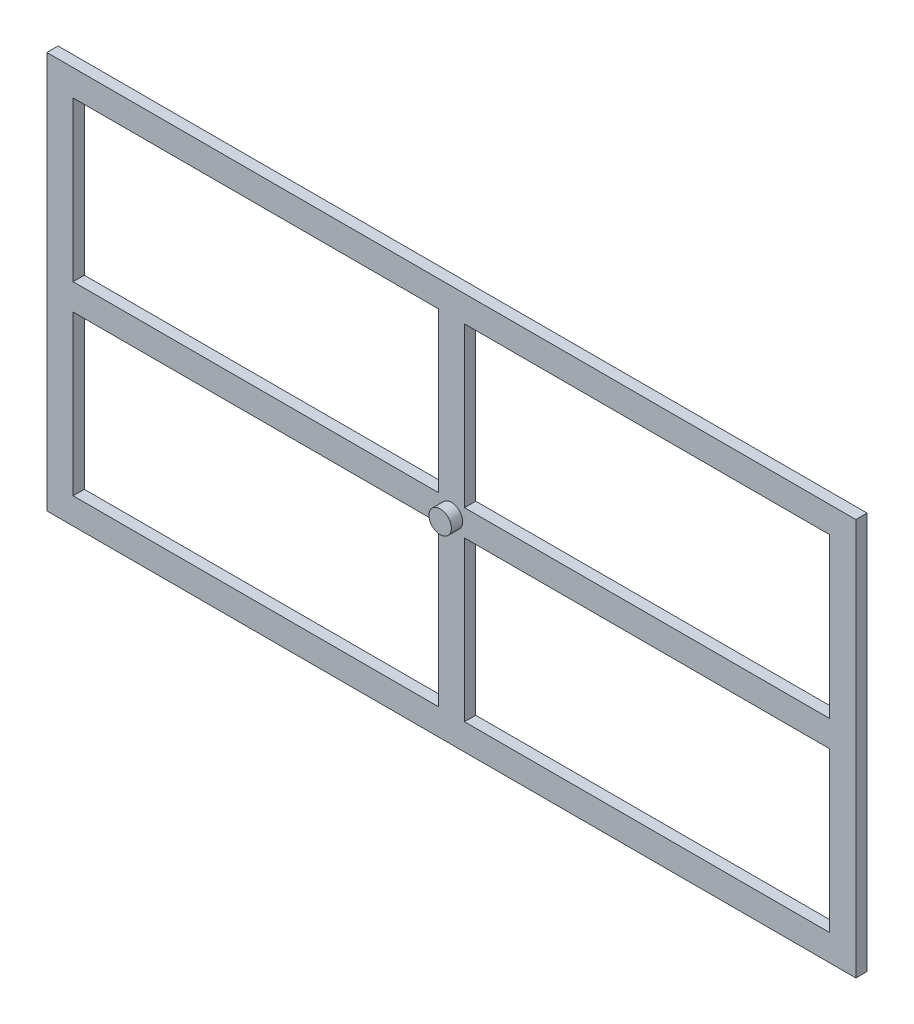
ISO-10303-21;
HEADER;
FILE_DESCRIPTION(('STEP AP214'),'2;1');
FILE_NAME('part.step','',(''),(''),'','','');
FILE_SCHEMA(('AUTOMOTIVE_DESIGN { 1 0 10303 214 1 1 1 1 }'));
ENDSEC;
DATA;
#1=APPLICATION_CONTEXT('core data for automotive mechanical design processes');
#2=APPLICATION_PROTOCOL_DEFINITION('international standard','automotive_design',2000,#1);
#3=PRODUCT_CONTEXT('',#1,'mechanical');
#4=PRODUCT('Part','Part','',(#3));
#5=PRODUCT_RELATED_PRODUCT_CATEGORY('part','',(#4));
#6=PRODUCT_DEFINITION_FORMATION('','',#4);
#7=PRODUCT_DEFINITION_CONTEXT('part definition',#1,'design');
#8=PRODUCT_DEFINITION('design','',#6,#7);
#9=PRODUCT_DEFINITION_SHAPE('','',#8);
#10=(LENGTH_UNIT() NAMED_UNIT(*) SI_UNIT(.MILLI.,.METRE.));
#11=(NAMED_UNIT(*) PLANE_ANGLE_UNIT() SI_UNIT($,.RADIAN.));
#12=(NAMED_UNIT(*) SI_UNIT($,.STERADIAN.) SOLID_ANGLE_UNIT());
#13=UNCERTAINTY_MEASURE_WITH_UNIT(LENGTH_MEASURE(1.E-05),#10,'distance_accuracy_value','');
#14=(GEOMETRIC_REPRESENTATION_CONTEXT(3) GLOBAL_UNCERTAINTY_ASSIGNED_CONTEXT((#13)) GLOBAL_UNIT_ASSIGNED_CONTEXT((#10,
#11,#12)) REPRESENTATION_CONTEXT('',''));
#15=CARTESIAN_POINT('',(0.,0.,0.));
#16=DIRECTION('',(0.,0.,1.));
#17=DIRECTION('',(1.,0.,0.));
#18=AXIS2_PLACEMENT_3D('',#15,#16,#17);
#19=CARTESIAN_POINT('',(0.,0.,3.));
#20=DIRECTION('',(0.,0.,1.));
#21=DIRECTION('',(1.,0.,0.));
#22=AXIS2_PLACEMENT_3D('',#19,#20,#21);
#23=PLANE('',#22);
#24=CARTESIAN_POINT('',(-24.3546378349002,-10.2943666012766,3.));
#25=DIRECTION('',(0.,0.,1.));
#26=DIRECTION('',(1.,0.,0.));
#27=AXIS2_PLACEMENT_3D('',#24,#25,#26);
#28=CIRCLE('',#27,3.);
#29=CARTESIAN_POINT('',(-21.3546378349002,-10.2943666012766,3.));
#30=VERTEX_POINT('',#29);
#31=EDGE_CURVE('E725',#30,#30,#28,.T.);
#32=ORIENTED_EDGE('',*,*,#31,.F.);
#33=EDGE_LOOP('',(#32));
#34=FACE_BOUND('',#33,.T.);
#35=DIRECTION('',(0.,-1.,0.));
#36=VECTOR('',#35,1.);
#37=CARTESIAN_POINT('',(-132.3546378349,42.7056333987234,3.));
#38=LINE('',#37,#36);
#39=CARTESIAN_POINT('',(-132.3546378349,42.7056333987234,3.));
#40=VERTEX_POINT('',#39);
#41=CARTESIAN_POINT('',(-132.3546378349,-63.2943666012766,3.));
#42=VERTEX_POINT('',#41);
#43=EDGE_CURVE('E361',#40,#42,#38,.T.);
#44=ORIENTED_EDGE('',*,*,#43,.T.);
#45=DIRECTION('',(1.,0.,0.));
#46=VECTOR('',#45,1.);
#47=CARTESIAN_POINT('',(-132.3546378349,-63.2943666012766,3.));
#48=LINE('',#47,#46);
#49=CARTESIAN_POINT('',(83.6453621650998,-63.2943666012766,3.));
#50=VERTEX_POINT('',#49);
#51=EDGE_CURVE('E365',#42,#50,#48,.T.);
#52=ORIENTED_EDGE('',*,*,#51,.T.);
#53=DIRECTION('',(0.,1.,0.));
#54=VECTOR('',#53,1.);
#55=CARTESIAN_POINT('',(83.6453621650998,42.7056333987234,3.));
#56=LINE('',#55,#54);
#57=CARTESIAN_POINT('',(83.6453621650998,42.7056333987234,3.));
#58=VERTEX_POINT('',#57);
#59=EDGE_CURVE('E369',#50,#58,#56,.T.);
#60=ORIENTED_EDGE('',*,*,#59,.T.);
#61=DIRECTION('',(-1.,0.,0.));
#62=VECTOR('',#61,1.);
#63=CARTESIAN_POINT('',(-132.3546378349,42.7056333987234,3.));
#64=LINE('',#63,#62);
#65=EDGE_CURVE('E372',#58,#40,#64,.T.);
#66=ORIENTED_EDGE('',*,*,#65,.T.);
#67=EDGE_LOOP('',(#44,#52,#60,#66));
#68=FACE_BOUND('',#67,.T.);
#69=DIRECTION('',(1.,0.,0.));
#70=VECTOR('',#69,1.);
#71=CARTESIAN_POINT('',(-125.3546378349,-6.7943666012766,3.));
#72=LINE('',#71,#70);
#73=CARTESIAN_POINT('',(-125.3546378349,-6.7943666012766,3.));
#74=VERTEX_POINT('',#73);
#75=CARTESIAN_POINT('',(-27.8546378349002,-6.7943666012766,3.));
#76=VERTEX_POINT('',#75);
#77=EDGE_CURVE('E321',#74,#76,#72,.T.);
#78=ORIENTED_EDGE('',*,*,#77,.F.);
#79=DIRECTION('',(0.,-1.,0.));
#80=VECTOR('',#79,1.);
#81=CARTESIAN_POINT('',(-125.3546378349,35.7056333987234,3.));
#82=LINE('',#81,#80);
#83=CARTESIAN_POINT('',(-125.3546378349,35.7056333987234,3.));
#84=VERTEX_POINT('',#83);
#85=EDGE_CURVE('E318',#84,#74,#82,.T.);
#86=ORIENTED_EDGE('',*,*,#85,.F.);
#87=DIRECTION('',(-1.,0.,0.));
#88=VECTOR('',#87,1.);
#89=CARTESIAN_POINT('',(-125.3546378349,35.7056333987234,3.));
#90=LINE('',#89,#88);
#91=CARTESIAN_POINT('',(-27.8546378349002,35.7056333987234,3.));
#92=VERTEX_POINT('',#91);
#93=EDGE_CURVE('E329',#92,#84,#90,.T.);
#94=ORIENTED_EDGE('',*,*,#93,.F.);
#95=DIRECTION('',(0.,1.,0.));
#96=VECTOR('',#95,1.);
#97=CARTESIAN_POINT('',(-27.8546378349002,35.7056333987234,3.));
#98=LINE('',#97,#96);
#99=EDGE_CURVE('E325',#76,#92,#98,.T.);
#100=ORIENTED_EDGE('',*,*,#99,.F.);
#101=EDGE_LOOP('',(#78,#86,#94,#100));
#102=FACE_BOUND('',#101,.T.);
#103=DIRECTION('',(1.,0.,0.));
#104=VECTOR('',#103,1.);
#105=CARTESIAN_POINT('',(-20.8546378349002,-6.7943666012766,3.));
#106=LINE('',#105,#104);
#107=CARTESIAN_POINT('',(-20.8546378349002,-6.7943666012766,3.));
#108=VERTEX_POINT('',#107);
#109=CARTESIAN_POINT('',(76.6453621650998,-6.7943666012766,3.));
#110=VERTEX_POINT('',#109);
#111=EDGE_CURVE('E278',#108,#110,#106,.T.);
#112=ORIENTED_EDGE('',*,*,#111,.F.);
#113=DIRECTION('',(0.,-1.,0.));
#114=VECTOR('',#113,1.);
#115=CARTESIAN_POINT('',(-20.8546378349002,35.7056333987234,3.));
#116=LINE('',#115,#114);
#117=CARTESIAN_POINT('',(-20.8546378349002,35.7056333987234,3.));
#118=VERTEX_POINT('',#117);
#119=EDGE_CURVE('E275',#118,#108,#116,.T.);
#120=ORIENTED_EDGE('',*,*,#119,.F.);
#121=DIRECTION('',(-1.,0.,0.));
#122=VECTOR('',#121,1.);
#123=CARTESIAN_POINT('',(-20.8546378349002,35.7056333987234,3.));
#124=LINE('',#123,#122);
#125=CARTESIAN_POINT('',(76.6453621650998,35.7056333987234,3.));
#126=VERTEX_POINT('',#125);
#127=EDGE_CURVE('E286',#126,#118,#124,.T.);
#128=ORIENTED_EDGE('',*,*,#127,.F.);
#129=DIRECTION('',(0.,1.,0.));
#130=VECTOR('',#129,1.);
#131=CARTESIAN_POINT('',(76.6453621650998,35.7056333987234,3.));
#132=LINE('',#131,#130);
#133=EDGE_CURVE('E282',#110,#126,#132,.T.);
#134=ORIENTED_EDGE('',*,*,#133,.F.);
#135=EDGE_LOOP('',(#112,#120,#128,#134));
#136=FACE_BOUND('',#135,.T.);
#137=DIRECTION('',(1.,0.,0.));
#138=VECTOR('',#137,1.);
#139=CARTESIAN_POINT('',(-20.8546378349002,-56.2943666012766,3.));
#140=LINE('',#139,#138);
#141=CARTESIAN_POINT('',(-20.8546378349002,-56.2943666012766,3.));
#142=VERTEX_POINT('',#141);
#143=CARTESIAN_POINT('',(76.6453621650998,-56.2943666012766,3.));
#144=VERTEX_POINT('',#143);
#145=EDGE_CURVE('E235',#142,#144,#140,.T.);
#146=ORIENTED_EDGE('',*,*,#145,.F.);
#147=DIRECTION('',(0.,-1.,0.));
#148=VECTOR('',#147,1.);
#149=CARTESIAN_POINT('',(-20.8546378349002,-13.7943666012766,3.));
#150=LINE('',#149,#148);
#151=CARTESIAN_POINT('',(-20.8546378349002,-13.7943666012766,3.));
#152=VERTEX_POINT('',#151);
#153=EDGE_CURVE('E232',#152,#142,#150,.T.);
#154=ORIENTED_EDGE('',*,*,#153,.F.);
#155=DIRECTION('',(-1.,0.,0.));
#156=VECTOR('',#155,1.);
#157=CARTESIAN_POINT('',(-20.8546378349002,-13.7943666012766,3.));
#158=LINE('',#157,#156);
#159=CARTESIAN_POINT('',(76.6453621650998,-13.7943666012766,3.));
#160=VERTEX_POINT('',#159);
#161=EDGE_CURVE('E243',#160,#152,#158,.T.);
#162=ORIENTED_EDGE('',*,*,#161,.F.);
#163=DIRECTION('',(0.,1.,0.));
#164=VECTOR('',#163,1.);
#165=CARTESIAN_POINT('',(76.6453621650998,-13.7943666012766,3.));
#166=LINE('',#165,#164);
#167=EDGE_CURVE('E239',#144,#160,#166,.T.);
#168=ORIENTED_EDGE('',*,*,#167,.F.);
#169=EDGE_LOOP('',(#146,#154,#162,#168));
#170=FACE_BOUND('',#169,.T.);
#171=DIRECTION('',(-1.,0.,0.));
#172=VECTOR('',#171,1.);
#173=CARTESIAN_POINT('',(-27.8546378349002,-13.7943666012766,3.));
#174=LINE('',#173,#172);
#175=CARTESIAN_POINT('',(-27.8546378349002,-13.7943666012766,3.));
#176=VERTEX_POINT('',#175);
#177=CARTESIAN_POINT('',(-125.3546378349,-13.7943666012766,3.));
#178=VERTEX_POINT('',#177);
#179=EDGE_CURVE('E191',#176,#178,#174,.T.);
#180=ORIENTED_EDGE('',*,*,#179,.F.);
#181=DIRECTION('',(0.,1.,0.));
#182=VECTOR('',#181,1.);
#183=CARTESIAN_POINT('',(-27.8546378349002,-56.2943666012766,3.));
#184=LINE('',#183,#182);
#185=CARTESIAN_POINT('',(-27.8546378349002,-56.2943666012766,3.));
#186=VERTEX_POINT('',#185);
#187=EDGE_CURVE('E182',#186,#176,#184,.T.);
#188=ORIENTED_EDGE('',*,*,#187,.F.);
#189=DIRECTION('',(1.,0.,0.));
#190=VECTOR('',#189,1.);
#191=CARTESIAN_POINT('',(-27.8546378349002,-56.2943666012766,3.));
#192=LINE('',#191,#190);
#193=CARTESIAN_POINT('',(-125.3546378349,-56.2943666012766,3.));
#194=VERTEX_POINT('',#193);
#195=EDGE_CURVE('E208',#194,#186,#192,.T.);
#196=ORIENTED_EDGE('',*,*,#195,.F.);
#197=DIRECTION('',(0.,-1.,0.));
#198=VECTOR('',#197,1.);
#199=CARTESIAN_POINT('',(-125.3546378349,-56.2943666012766,3.));
#200=LINE('',#199,#198);
#201=EDGE_CURVE('E204',#178,#194,#200,.T.);
#202=ORIENTED_EDGE('',*,*,#201,.F.);
#203=EDGE_LOOP('',(#180,#188,#196,#202));
#204=FACE_BOUND('',#203,.T.);
#205=ADVANCED_FACE('F44',(#34,#68,#102,#136,#170,#204),#23,.T.);
#206=CARTESIAN_POINT('',(0.,0.,0.));
#207=DIRECTION('',(0.,0.,1.));
#208=DIRECTION('',(1.,0.,0.));
#209=AXIS2_PLACEMENT_3D('',#206,#207,#208);
#210=PLANE('',#209);
#211=CARTESIAN_POINT('',(-128.3546378349,38.7056333987234,0.));
#212=DIRECTION('',(0.,0.,-1.));
#213=DIRECTION('',(-1.,0.,0.));
#214=AXIS2_PLACEMENT_3D('',#211,#212,#213);
#215=CIRCLE('',#214,2.);
#216=CARTESIAN_POINT('',(-130.3546378349,38.7056333987234,0.));
#217=VERTEX_POINT('',#216);
#218=EDGE_CURVE('E704',#217,#217,#215,.T.);
#219=ORIENTED_EDGE('',*,*,#218,.F.);
#220=EDGE_LOOP('',(#219));
#221=FACE_BOUND('',#220,.T.);
#222=CARTESIAN_POINT('',(79.6453621650998,-59.2943666012766,0.));
#223=DIRECTION('',(0.,0.,-1.));
#224=DIRECTION('',(-1.,0.,0.));
#225=AXIS2_PLACEMENT_3D('',#222,#223,#224);
#226=CIRCLE('',#225,2.);
#227=CARTESIAN_POINT('',(77.6453621650998,-59.2943666012766,0.));
#228=VERTEX_POINT('',#227);
#229=EDGE_CURVE('E705',#228,#228,#226,.T.);
#230=ORIENTED_EDGE('',*,*,#229,.F.);
#231=EDGE_LOOP('',(#230));
#232=FACE_BOUND('',#231,.T.);
#233=CARTESIAN_POINT('',(-128.3546378349,-59.2943666012766,0.));
#234=DIRECTION('',(0.,0.,-1.));
#235=DIRECTION('',(-1.,0.,0.));
#236=AXIS2_PLACEMENT_3D('',#233,#234,#235);
#237=CIRCLE('',#236,2.);
#238=CARTESIAN_POINT('',(-130.3546378349,-59.2943666012766,0.));
#239=VERTEX_POINT('',#238);
#240=EDGE_CURVE('E720',#239,#239,#237,.T.);
#241=ORIENTED_EDGE('',*,*,#240,.F.);
#242=EDGE_LOOP('',(#241));
#243=FACE_BOUND('',#242,.T.);
#244=CARTESIAN_POINT('',(79.6453621650998,38.7056333987234,0.));
#245=DIRECTION('',(0.,0.,-1.));
#246=DIRECTION('',(-1.,0.,0.));
#247=AXIS2_PLACEMENT_3D('',#244,#245,#246);
#248=CIRCLE('',#247,2.);
#249=CARTESIAN_POINT('',(77.6453621650998,38.7056333987234,0.));
#250=VERTEX_POINT('',#249);
#251=EDGE_CURVE('E710',#250,#250,#248,.T.);
#252=ORIENTED_EDGE('',*,*,#251,.F.);
#253=EDGE_LOOP('',(#252));
#254=FACE_BOUND('',#253,.T.);
#255=DIRECTION('',(0.,-1.,0.));
#256=VECTOR('',#255,1.);
#257=CARTESIAN_POINT('',(-20.8546378349002,-13.7943666012766,0.));
#258=LINE('',#257,#256);
#259=CARTESIAN_POINT('',(-20.8546378349002,-13.7943666012766,0.));
#260=VERTEX_POINT('',#259);
#261=CARTESIAN_POINT('',(-20.8546378349002,-56.2943666012766,0.));
#262=VERTEX_POINT('',#261);
#263=EDGE_CURVE('E200',#260,#262,#258,.T.);
#264=ORIENTED_EDGE('',*,*,#263,.T.);
#265=DIRECTION('',(1.,0.,0.));
#266=VECTOR('',#265,1.);
#267=CARTESIAN_POINT('',(-20.8546378349002,-56.2943666012766,0.));
#268=LINE('',#267,#266);
#269=CARTESIAN_POINT('',(76.6453621650998,-56.2943666012766,0.));
#270=VERTEX_POINT('',#269);
#271=EDGE_CURVE('E250',#262,#270,#268,.T.);
#272=ORIENTED_EDGE('',*,*,#271,.T.);
#273=DIRECTION('',(0.,1.,0.));
#274=VECTOR('',#273,1.);
#275=CARTESIAN_POINT('',(76.6453621650998,-13.7943666012766,0.));
#276=LINE('',#275,#274);
#277=CARTESIAN_POINT('',(76.6453621650998,-13.7943666012766,0.));
#278=VERTEX_POINT('',#277);
#279=EDGE_CURVE('E254',#270,#278,#276,.T.);
#280=ORIENTED_EDGE('',*,*,#279,.T.);
#281=DIRECTION('',(-1.,0.,0.));
#282=VECTOR('',#281,1.);
#283=CARTESIAN_POINT('',(-20.8546378349002,-13.7943666012766,0.));
#284=LINE('',#283,#282);
#285=EDGE_CURVE('E236',#278,#260,#284,.T.);
#286=ORIENTED_EDGE('',*,*,#285,.T.);
#287=EDGE_LOOP('',(#264,#272,#280,#286));
#288=FACE_BOUND('',#287,.T.);
#289=DIRECTION('',(0.,-1.,0.));
#290=VECTOR('',#289,1.);
#291=CARTESIAN_POINT('',(-125.3546378349,35.7056333987234,0.));
#292=LINE('',#291,#290);
#293=CARTESIAN_POINT('',(-125.3546378349,35.7056333987234,0.));
#294=VERTEX_POINT('',#293);
#295=CARTESIAN_POINT('',(-125.3546378349,-6.7943666012766,0.));
#296=VERTEX_POINT('',#295);
#297=EDGE_CURVE('E317',#294,#296,#292,.T.);
#298=ORIENTED_EDGE('',*,*,#297,.T.);
#299=DIRECTION('',(1.,0.,0.));
#300=VECTOR('',#299,1.);
#301=CARTESIAN_POINT('',(-125.3546378349,-6.7943666012766,0.));
#302=LINE('',#301,#300);
#303=CARTESIAN_POINT('',(-27.8546378349002,-6.7943666012766,0.));
#304=VERTEX_POINT('',#303);
#305=EDGE_CURVE('E336',#296,#304,#302,.T.);
#306=ORIENTED_EDGE('',*,*,#305,.T.);
#307=DIRECTION('',(0.,1.,0.));
#308=VECTOR('',#307,1.);
#309=CARTESIAN_POINT('',(-27.8546378349002,35.7056333987234,0.));
#310=LINE('',#309,#308);
#311=CARTESIAN_POINT('',(-27.8546378349002,35.7056333987234,0.));
#312=VERTEX_POINT('',#311);
#313=EDGE_CURVE('E340',#304,#312,#310,.T.);
#314=ORIENTED_EDGE('',*,*,#313,.T.);
#315=DIRECTION('',(-1.,0.,0.));
#316=VECTOR('',#315,1.);
#317=CARTESIAN_POINT('',(-125.3546378349,35.7056333987234,0.));
#318=LINE('',#317,#316);
#319=EDGE_CURVE('E322',#312,#294,#318,.T.);
#320=ORIENTED_EDGE('',*,*,#319,.T.);
#321=EDGE_LOOP('',(#298,#306,#314,#320));
#322=FACE_BOUND('',#321,.T.);
#323=DIRECTION('',(0.,-1.,0.));
#324=VECTOR('',#323,1.);
#325=CARTESIAN_POINT('',(-132.3546378349,42.7056333987234,0.));
#326=LINE('',#325,#324);
#327=CARTESIAN_POINT('',(-132.3546378349,42.7056333987234,0.));
#328=VERTEX_POINT('',#327);
#329=CARTESIAN_POINT('',(-132.3546378349,-63.2943666012766,0.));
#330=VERTEX_POINT('',#329);
#331=EDGE_CURVE('E360',#328,#330,#326,.T.);
#332=ORIENTED_EDGE('',*,*,#331,.F.);
#333=DIRECTION('',(-1.,0.,0.));
#334=VECTOR('',#333,1.);
#335=CARTESIAN_POINT('',(-132.3546378349,42.7056333987234,0.));
#336=LINE('',#335,#334);
#337=CARTESIAN_POINT('',(83.6453621650998,42.7056333987234,0.));
#338=VERTEX_POINT('',#337);
#339=EDGE_CURVE('E366',#338,#328,#336,.T.);
#340=ORIENTED_EDGE('',*,*,#339,.F.);
#341=DIRECTION('',(0.,1.,0.));
#342=VECTOR('',#341,1.);
#343=CARTESIAN_POINT('',(83.6453621650998,42.7056333987234,0.));
#344=LINE('',#343,#342);
#345=CARTESIAN_POINT('',(83.6453621650998,-63.2943666012766,0.));
#346=VERTEX_POINT('',#345);
#347=EDGE_CURVE('E382',#346,#338,#344,.T.);
#348=ORIENTED_EDGE('',*,*,#347,.F.);
#349=DIRECTION('',(1.,0.,0.));
#350=VECTOR('',#349,1.);
#351=CARTESIAN_POINT('',(-132.3546378349,-63.2943666012766,0.));
#352=LINE('',#351,#350);
#353=EDGE_CURVE('E379',#330,#346,#352,.T.);
#354=ORIENTED_EDGE('',*,*,#353,.F.);
#355=EDGE_LOOP('',(#332,#340,#348,#354));
#356=FACE_BOUND('',#355,.T.);
#357=DIRECTION('',(0.,-1.,0.));
#358=VECTOR('',#357,1.);
#359=CARTESIAN_POINT('',(-20.8546378349002,35.7056333987234,0.));
#360=LINE('',#359,#358);
#361=CARTESIAN_POINT('',(-20.8546378349002,35.7056333987234,0.));
#362=VERTEX_POINT('',#361);
#363=CARTESIAN_POINT('',(-20.8546378349002,-6.7943666012766,0.));
#364=VERTEX_POINT('',#363);
#365=EDGE_CURVE('E274',#362,#364,#360,.T.);
#366=ORIENTED_EDGE('',*,*,#365,.T.);
#367=DIRECTION('',(1.,0.,0.));
#368=VECTOR('',#367,1.);
#369=CARTESIAN_POINT('',(-20.8546378349002,-6.7943666012766,0.));
#370=LINE('',#369,#368);
#371=CARTESIAN_POINT('',(76.6453621650998,-6.7943666012766,0.));
#372=VERTEX_POINT('',#371);
#373=EDGE_CURVE('E293',#364,#372,#370,.T.);
#374=ORIENTED_EDGE('',*,*,#373,.T.);
#375=DIRECTION('',(0.,1.,0.));
#376=VECTOR('',#375,1.);
#377=CARTESIAN_POINT('',(76.6453621650998,35.7056333987234,0.));
#378=LINE('',#377,#376);
#379=CARTESIAN_POINT('',(76.6453621650998,35.7056333987234,0.));
#380=VERTEX_POINT('',#379);
#381=EDGE_CURVE('E297',#372,#380,#378,.T.);
#382=ORIENTED_EDGE('',*,*,#381,.T.);
#383=DIRECTION('',(-1.,0.,0.));
#384=VECTOR('',#383,1.);
#385=CARTESIAN_POINT('',(-20.8546378349002,35.7056333987234,0.));
#386=LINE('',#385,#384);
#387=EDGE_CURVE('E279',#380,#362,#386,.T.);
#388=ORIENTED_EDGE('',*,*,#387,.T.);
#389=EDGE_LOOP('',(#366,#374,#382,#388));
#390=FACE_BOUND('',#389,.T.);
#391=DIRECTION('',(0.,1.,0.));
#392=VECTOR('',#391,1.);
#393=CARTESIAN_POINT('',(-27.8546378349002,-56.2943666012766,0.));
#394=LINE('',#393,#392);
#395=CARTESIAN_POINT('',(-27.8546378349002,-56.2943666012766,0.));
#396=VERTEX_POINT('',#395);
#397=CARTESIAN_POINT('',(-27.8546378349002,-13.7943666012766,0.));
#398=VERTEX_POINT('',#397);
#399=EDGE_CURVE('E68',#396,#398,#394,.T.);
#400=ORIENTED_EDGE('',*,*,#399,.T.);
#401=DIRECTION('',(-1.,0.,0.));
#402=VECTOR('',#401,1.);
#403=CARTESIAN_POINT('',(-27.8546378349002,-13.7943666012766,0.));
#404=LINE('',#403,#402);
#405=CARTESIAN_POINT('',(-125.3546378349,-13.7943666012766,0.));
#406=VERTEX_POINT('',#405);
#407=EDGE_CURVE('E198',#398,#406,#404,.T.);
#408=ORIENTED_EDGE('',*,*,#407,.T.);
#409=DIRECTION('',(0.,-1.,0.));
#410=VECTOR('',#409,1.);
#411=CARTESIAN_POINT('',(-125.3546378349,-56.2943666012766,0.));
#412=LINE('',#411,#410);
#413=CARTESIAN_POINT('',(-125.3546378349,-56.2943666012766,0.));
#414=VERTEX_POINT('',#413);
#415=EDGE_CURVE('E219',#406,#414,#412,.T.);
#416=ORIENTED_EDGE('',*,*,#415,.T.);
#417=DIRECTION('',(1.,0.,0.));
#418=VECTOR('',#417,1.);
#419=CARTESIAN_POINT('',(-27.8546378349002,-56.2943666012766,0.));
#420=LINE('',#419,#418);
#421=EDGE_CURVE('E192',#414,#396,#420,.T.);
#422=ORIENTED_EDGE('',*,*,#421,.T.);
#423=EDGE_LOOP('',(#400,#408,#416,#422));
#424=FACE_BOUND('',#423,.T.);
#425=ADVANCED_FACE('F405',(#221,#232,#243,#254,#288,#322,#356,#390,#424),#210,.F.);
#426=CARTESIAN_POINT('',(-132.3546378349,42.7056333987234,3.));
#427=DIRECTION('',(1.,0.,0.));
#428=DIRECTION('',(0.,0.,-1.));
#429=AXIS2_PLACEMENT_3D('',#426,#427,#428);
#430=PLANE('',#429);
#431=ORIENTED_EDGE('',*,*,#331,.T.);
#432=DIRECTION('',(0.,0.,-1.));
#433=VECTOR('',#432,1.);
#434=CARTESIAN_POINT('',(-132.3546378349,-63.2943666012766,3.));
#435=LINE('',#434,#433);
#436=EDGE_CURVE('E11',#42,#330,#435,.T.);
#437=ORIENTED_EDGE('',*,*,#436,.F.);
#438=ORIENTED_EDGE('',*,*,#43,.F.);
#439=DIRECTION('',(0.,0.,-1.));
#440=VECTOR('',#439,1.);
#441=CARTESIAN_POINT('',(-132.3546378349,42.7056333987234,3.));
#442=LINE('',#441,#440);
#443=EDGE_CURVE('E375',#40,#328,#442,.T.);
#444=ORIENTED_EDGE('',*,*,#443,.T.);
#445=EDGE_LOOP('',(#431,#437,#438,#444));
#446=FACE_BOUND('',#445,.T.);
#447=ADVANCED_FACE('F46',(#446),#430,.F.);
#448=CARTESIAN_POINT('',(-132.3546378349,-63.2943666012766,3.));
#449=DIRECTION('',(0.,1.,0.));
#450=DIRECTION('',(0.,0.,1.));
#451=AXIS2_PLACEMENT_3D('',#448,#449,#450);
#452=PLANE('',#451);
#453=ORIENTED_EDGE('',*,*,#353,.T.);
#454=DIRECTION('',(0.,0.,-1.));
#455=VECTOR('',#454,1.);
#456=CARTESIAN_POINT('',(83.6453621650998,-63.2943666012766,3.));
#457=LINE('',#456,#455);
#458=EDGE_CURVE('E53',#50,#346,#457,.T.);
#459=ORIENTED_EDGE('',*,*,#458,.F.);
#460=ORIENTED_EDGE('',*,*,#51,.F.);
#461=ORIENTED_EDGE('',*,*,#436,.T.);
#462=EDGE_LOOP('',(#453,#459,#460,#461));
#463=FACE_BOUND('',#462,.T.);
#464=ADVANCED_FACE('F416',(#463),#452,.F.);
#465=CARTESIAN_POINT('',(83.6453621650998,42.7056333987234,3.));
#466=DIRECTION('',(-1.,0.,0.));
#467=DIRECTION('',(0.,0.,1.));
#468=AXIS2_PLACEMENT_3D('',#465,#466,#467);
#469=PLANE('',#468);
#470=ORIENTED_EDGE('',*,*,#347,.T.);
#471=DIRECTION('',(0.,0.,-1.));
#472=VECTOR('',#471,1.);
#473=CARTESIAN_POINT('',(83.6453621650998,42.7056333987234,3.));
#474=LINE('',#473,#472);
#475=EDGE_CURVE('E390',#58,#338,#474,.T.);
#476=ORIENTED_EDGE('',*,*,#475,.F.);
#477=ORIENTED_EDGE('',*,*,#59,.F.);
#478=ORIENTED_EDGE('',*,*,#458,.T.);
#479=EDGE_LOOP('',(#470,#476,#477,#478));
#480=FACE_BOUND('',#479,.T.);
#481=ADVANCED_FACE('F399',(#480),#469,.F.);
#482=CARTESIAN_POINT('',(-132.3546378349,42.7056333987234,3.));
#483=DIRECTION('',(0.,-1.,0.));
#484=DIRECTION('',(0.,0.,-1.));
#485=AXIS2_PLACEMENT_3D('',#482,#483,#484);
#486=PLANE('',#485);
#487=ORIENTED_EDGE('',*,*,#339,.T.);
#488=ORIENTED_EDGE('',*,*,#443,.F.);
#489=ORIENTED_EDGE('',*,*,#65,.F.);
#490=ORIENTED_EDGE('',*,*,#475,.T.);
#491=EDGE_LOOP('',(#487,#488,#489,#490));
#492=FACE_BOUND('',#491,.T.);
#493=ADVANCED_FACE('F409',(#492),#486,.F.);
#494=CARTESIAN_POINT('',(-125.3546378349,35.7056333987234,3.));
#495=DIRECTION('',(1.,0.,0.));
#496=DIRECTION('',(0.,0.,-1.));
#497=AXIS2_PLACEMENT_3D('',#494,#495,#496);
#498=PLANE('',#497);
#499=ORIENTED_EDGE('',*,*,#297,.F.);
#500=DIRECTION('',(0.,0.,-1.));
#501=VECTOR('',#500,1.);
#502=CARTESIAN_POINT('',(-125.3546378349,35.7056333987234,3.));
#503=LINE('',#502,#501);
#504=EDGE_CURVE('E332',#84,#294,#503,.T.);
#505=ORIENTED_EDGE('',*,*,#504,.F.);
#506=ORIENTED_EDGE('',*,*,#85,.T.);
#507=DIRECTION('',(0.,0.,-1.));
#508=VECTOR('',#507,1.);
#509=CARTESIAN_POINT('',(-125.3546378349,-6.7943666012766,3.));
#510=LINE('',#509,#508);
#511=EDGE_CURVE('E356',#74,#296,#510,.T.);
#512=ORIENTED_EDGE('',*,*,#511,.T.);
#513=EDGE_LOOP('',(#499,#505,#506,#512));
#514=FACE_BOUND('',#513,.T.);
#515=ADVANCED_FACE('F435',(#514),#498,.T.);
#516=CARTESIAN_POINT('',(-125.3546378349,-6.7943666012766,3.));
#517=DIRECTION('',(0.,1.,0.));
#518=DIRECTION('',(0.,0.,1.));
#519=AXIS2_PLACEMENT_3D('',#516,#517,#518);
#520=PLANE('',#519);
#521=ORIENTED_EDGE('',*,*,#305,.F.);
#522=ORIENTED_EDGE('',*,*,#511,.F.);
#523=ORIENTED_EDGE('',*,*,#77,.T.);
#524=DIRECTION('',(0.,0.,-1.));
#525=VECTOR('',#524,1.);
#526=CARTESIAN_POINT('',(-27.8546378349002,-6.7943666012766,3.));
#527=LINE('',#526,#525);
#528=EDGE_CURVE('E353',#76,#304,#527,.T.);
#529=ORIENTED_EDGE('',*,*,#528,.T.);
#530=EDGE_LOOP('',(#521,#522,#523,#529));
#531=FACE_BOUND('',#530,.T.);
#532=ADVANCED_FACE('F442',(#531),#520,.T.);
#533=CARTESIAN_POINT('',(-27.8546378349002,35.7056333987234,3.));
#534=DIRECTION('',(-1.,0.,0.));
#535=DIRECTION('',(0.,0.,1.));
#536=AXIS2_PLACEMENT_3D('',#533,#534,#535);
#537=PLANE('',#536);
#538=ORIENTED_EDGE('',*,*,#313,.F.);
#539=ORIENTED_EDGE('',*,*,#528,.F.);
#540=ORIENTED_EDGE('',*,*,#99,.T.);
#541=DIRECTION('',(0.,0.,-1.));
#542=VECTOR('',#541,1.);
#543=CARTESIAN_POINT('',(-27.8546378349002,35.7056333987234,3.));
#544=LINE('',#543,#542);
#545=EDGE_CURVE('E350',#92,#312,#544,.T.);
#546=ORIENTED_EDGE('',*,*,#545,.T.);
#547=EDGE_LOOP('',(#538,#539,#540,#546));
#548=FACE_BOUND('',#547,.T.);
#549=ADVANCED_FACE('F447',(#548),#537,.T.);
#550=CARTESIAN_POINT('',(-125.3546378349,35.7056333987234,3.));
#551=DIRECTION('',(0.,-1.,0.));
#552=DIRECTION('',(0.,0.,-1.));
#553=AXIS2_PLACEMENT_3D('',#550,#551,#552);
#554=PLANE('',#553);
#555=ORIENTED_EDGE('',*,*,#319,.F.);
#556=ORIENTED_EDGE('',*,*,#545,.F.);
#557=ORIENTED_EDGE('',*,*,#93,.T.);
#558=ORIENTED_EDGE('',*,*,#504,.T.);
#559=EDGE_LOOP('',(#555,#556,#557,#558));
#560=FACE_BOUND('',#559,.T.);
#561=ADVANCED_FACE('F455',(#560),#554,.T.);
#562=CARTESIAN_POINT('',(-20.8546378349002,35.7056333987234,3.));
#563=DIRECTION('',(1.,0.,0.));
#564=DIRECTION('',(0.,0.,-1.));
#565=AXIS2_PLACEMENT_3D('',#562,#563,#564);
#566=PLANE('',#565);
#567=ORIENTED_EDGE('',*,*,#365,.F.);
#568=DIRECTION('',(0.,0.,-1.));
#569=VECTOR('',#568,1.);
#570=CARTESIAN_POINT('',(-20.8546378349002,35.7056333987234,3.));
#571=LINE('',#570,#569);
#572=EDGE_CURVE('E289',#118,#362,#571,.T.);
#573=ORIENTED_EDGE('',*,*,#572,.F.);
#574=ORIENTED_EDGE('',*,*,#119,.T.);
#575=DIRECTION('',(0.,0.,-1.));
#576=VECTOR('',#575,1.);
#577=CARTESIAN_POINT('',(-20.8546378349002,-6.7943666012766,3.));
#578=LINE('',#577,#576);
#579=EDGE_CURVE('E313',#108,#364,#578,.T.);
#580=ORIENTED_EDGE('',*,*,#579,.T.);
#581=EDGE_LOOP('',(#567,#573,#574,#580));
#582=FACE_BOUND('',#581,.T.);
#583=ADVANCED_FACE('F510',(#582),#566,.T.);
#584=CARTESIAN_POINT('',(-20.8546378349002,-6.7943666012766,3.));
#585=DIRECTION('',(0.,1.,0.));
#586=DIRECTION('',(0.,0.,1.));
#587=AXIS2_PLACEMENT_3D('',#584,#585,#586);
#588=PLANE('',#587);
#589=ORIENTED_EDGE('',*,*,#373,.F.);
#590=ORIENTED_EDGE('',*,*,#579,.F.);
#591=ORIENTED_EDGE('',*,*,#111,.T.);
#592=DIRECTION('',(0.,0.,-1.));
#593=VECTOR('',#592,1.);
#594=CARTESIAN_POINT('',(76.6453621650998,-6.7943666012766,3.));
#595=LINE('',#594,#593);
#596=EDGE_CURVE('E310',#110,#372,#595,.T.);
#597=ORIENTED_EDGE('',*,*,#596,.T.);
#598=EDGE_LOOP('',(#589,#590,#591,#597));
#599=FACE_BOUND('',#598,.T.);
#600=ADVANCED_FACE('F506',(#599),#588,.T.);
#601=CARTESIAN_POINT('',(76.6453621650998,35.7056333987234,3.));
#602=DIRECTION('',(-1.,0.,0.));
#603=DIRECTION('',(0.,0.,1.));
#604=AXIS2_PLACEMENT_3D('',#601,#602,#603);
#605=PLANE('',#604);
#606=ORIENTED_EDGE('',*,*,#381,.F.);
#607=ORIENTED_EDGE('',*,*,#596,.F.);
#608=ORIENTED_EDGE('',*,*,#133,.T.);
#609=DIRECTION('',(0.,0.,-1.));
#610=VECTOR('',#609,1.);
#611=CARTESIAN_POINT('',(76.6453621650998,35.7056333987234,3.));
#612=LINE('',#611,#610);
#613=EDGE_CURVE('E307',#126,#380,#612,.T.);
#614=ORIENTED_EDGE('',*,*,#613,.T.);
#615=EDGE_LOOP('',(#606,#607,#608,#614));
#616=FACE_BOUND('',#615,.T.);
#617=ADVANCED_FACE('F502',(#616),#605,.T.);
#618=CARTESIAN_POINT('',(-20.8546378349002,35.7056333987234,3.));
#619=DIRECTION('',(0.,-1.,0.));
#620=DIRECTION('',(0.,0.,-1.));
#621=AXIS2_PLACEMENT_3D('',#618,#619,#620);
#622=PLANE('',#621);
#623=ORIENTED_EDGE('',*,*,#387,.F.);
#624=ORIENTED_EDGE('',*,*,#613,.F.);
#625=ORIENTED_EDGE('',*,*,#127,.T.);
#626=ORIENTED_EDGE('',*,*,#572,.T.);
#627=EDGE_LOOP('',(#623,#624,#625,#626));
#628=FACE_BOUND('',#627,.T.);
#629=ADVANCED_FACE('F499',(#628),#622,.T.);
#630=CARTESIAN_POINT('',(-20.8546378349002,-13.7943666012766,3.));
#631=DIRECTION('',(1.,0.,0.));
#632=DIRECTION('',(0.,0.,-1.));
#633=AXIS2_PLACEMENT_3D('',#630,#631,#632);
#634=PLANE('',#633);
#635=ORIENTED_EDGE('',*,*,#263,.F.);
#636=DIRECTION('',(0.,0.,-1.));
#637=VECTOR('',#636,1.);
#638=CARTESIAN_POINT('',(-20.8546378349002,-13.7943666012766,3.));
#639=LINE('',#638,#637);
#640=EDGE_CURVE('E246',#152,#260,#639,.T.);
#641=ORIENTED_EDGE('',*,*,#640,.F.);
#642=ORIENTED_EDGE('',*,*,#153,.T.);
#643=DIRECTION('',(0.,0.,-1.));
#644=VECTOR('',#643,1.);
#645=CARTESIAN_POINT('',(-20.8546378349002,-56.2943666012766,3.));
#646=LINE('',#645,#644);
#647=EDGE_CURVE('E270',#142,#262,#646,.T.);
#648=ORIENTED_EDGE('',*,*,#647,.T.);
#649=EDGE_LOOP('',(#635,#641,#642,#648));
#650=FACE_BOUND('',#649,.T.);
#651=ADVANCED_FACE('F481',(#650),#634,.T.);
#652=CARTESIAN_POINT('',(-20.8546378349002,-56.2943666012766,3.));
#653=DIRECTION('',(0.,1.,0.));
#654=DIRECTION('',(0.,0.,1.));
#655=AXIS2_PLACEMENT_3D('',#652,#653,#654);
#656=PLANE('',#655);
#657=ORIENTED_EDGE('',*,*,#271,.F.);
#658=ORIENTED_EDGE('',*,*,#647,.F.);
#659=ORIENTED_EDGE('',*,*,#145,.T.);
#660=DIRECTION('',(0.,0.,-1.));
#661=VECTOR('',#660,1.);
#662=CARTESIAN_POINT('',(76.6453621650998,-56.2943666012766,3.));
#663=LINE('',#662,#661);
#664=EDGE_CURVE('E267',#144,#270,#663,.T.);
#665=ORIENTED_EDGE('',*,*,#664,.T.);
#666=EDGE_LOOP('',(#657,#658,#659,#665));
#667=FACE_BOUND('',#666,.T.);
#668=ADVANCED_FACE('F474',(#667),#656,.T.);
#669=CARTESIAN_POINT('',(76.6453621650998,-13.7943666012766,3.));
#670=DIRECTION('',(-1.,0.,0.));
#671=DIRECTION('',(0.,0.,1.));
#672=AXIS2_PLACEMENT_3D('',#669,#670,#671);
#673=PLANE('',#672);
#674=ORIENTED_EDGE('',*,*,#279,.F.);
#675=ORIENTED_EDGE('',*,*,#664,.F.);
#676=ORIENTED_EDGE('',*,*,#167,.T.);
#677=DIRECTION('',(0.,0.,-1.));
#678=VECTOR('',#677,1.);
#679=CARTESIAN_POINT('',(76.6453621650998,-13.7943666012766,3.));
#680=LINE('',#679,#678);
#681=EDGE_CURVE('E264',#160,#278,#680,.T.);
#682=ORIENTED_EDGE('',*,*,#681,.T.);
#683=EDGE_LOOP('',(#674,#675,#676,#682));
#684=FACE_BOUND('',#683,.T.);
#685=ADVANCED_FACE('F477',(#684),#673,.T.);
#686=CARTESIAN_POINT('',(-20.8546378349002,-13.7943666012766,3.));
#687=DIRECTION('',(0.,-1.,0.));
#688=DIRECTION('',(0.,0.,-1.));
#689=AXIS2_PLACEMENT_3D('',#686,#687,#688);
#690=PLANE('',#689);
#691=ORIENTED_EDGE('',*,*,#285,.F.);
#692=ORIENTED_EDGE('',*,*,#681,.F.);
#693=ORIENTED_EDGE('',*,*,#161,.T.);
#694=ORIENTED_EDGE('',*,*,#640,.T.);
#695=EDGE_LOOP('',(#691,#692,#693,#694));
#696=FACE_BOUND('',#695,.T.);
#697=ADVANCED_FACE('F484',(#696),#690,.T.);
#698=CARTESIAN_POINT('',(-27.8546378349002,-56.2943666012766,3.));
#699=DIRECTION('',(-1.,0.,0.));
#700=DIRECTION('',(0.,0.,1.));
#701=AXIS2_PLACEMENT_3D('',#698,#699,#700);
#702=PLANE('',#701);
#703=ORIENTED_EDGE('',*,*,#399,.F.);
#704=DIRECTION('',(0.,0.,-1.));
#705=VECTOR('',#704,1.);
#706=CARTESIAN_POINT('',(-27.8546378349002,-56.2943666012766,3.));
#707=LINE('',#706,#705);
#708=EDGE_CURVE('E186',#186,#396,#707,.T.);
#709=ORIENTED_EDGE('',*,*,#708,.F.);
#710=ORIENTED_EDGE('',*,*,#187,.T.);
#711=DIRECTION('',(0.,0.,-1.));
#712=VECTOR('',#711,1.);
#713=CARTESIAN_POINT('',(-27.8546378349002,-13.7943666012766,3.));
#714=LINE('',#713,#712);
#715=EDGE_CURVE('E185',#176,#398,#714,.T.);
#716=ORIENTED_EDGE('',*,*,#715,.T.);
#717=EDGE_LOOP('',(#703,#709,#710,#716));
#718=FACE_BOUND('',#717,.T.);
#719=ADVANCED_FACE('F184',(#718),#702,.T.);
#720=CARTESIAN_POINT('',(-27.8546378349002,-13.7943666012766,3.));
#721=DIRECTION('',(0.,-1.,0.));
#722=DIRECTION('',(0.,0.,-1.));
#723=AXIS2_PLACEMENT_3D('',#720,#721,#722);
#724=PLANE('',#723);
#725=ORIENTED_EDGE('',*,*,#407,.F.);
#726=ORIENTED_EDGE('',*,*,#715,.F.);
#727=ORIENTED_EDGE('',*,*,#179,.T.);
#728=DIRECTION('',(0.,0.,-1.));
#729=VECTOR('',#728,1.);
#730=CARTESIAN_POINT('',(-125.3546378349,-13.7943666012766,3.));
#731=LINE('',#730,#729);
#732=EDGE_CURVE('E201',#178,#406,#731,.T.);
#733=ORIENTED_EDGE('',*,*,#732,.T.);
#734=EDGE_LOOP('',(#725,#726,#727,#733));
#735=FACE_BOUND('',#734,.T.);
#736=ADVANCED_FACE('F195',(#735),#724,.T.);
#737=CARTESIAN_POINT('',(-125.3546378349,-56.2943666012766,3.));
#738=DIRECTION('',(1.,0.,0.));
#739=DIRECTION('',(0.,0.,-1.));
#740=AXIS2_PLACEMENT_3D('',#737,#738,#739);
#741=PLANE('',#740);
#742=ORIENTED_EDGE('',*,*,#415,.F.);
#743=ORIENTED_EDGE('',*,*,#732,.F.);
#744=ORIENTED_EDGE('',*,*,#201,.T.);
#745=DIRECTION('',(0.,0.,-1.));
#746=VECTOR('',#745,1.);
#747=CARTESIAN_POINT('',(-125.3546378349,-56.2943666012766,3.));
#748=LINE('',#747,#746);
#749=EDGE_CURVE('E60',#194,#414,#748,.T.);
#750=ORIENTED_EDGE('',*,*,#749,.T.);
#751=EDGE_LOOP('',(#742,#743,#744,#750));
#752=FACE_BOUND('',#751,.T.);
#753=ADVANCED_FACE('F582',(#752),#741,.T.);
#754=CARTESIAN_POINT('',(-27.8546378349002,-56.2943666012766,3.));
#755=DIRECTION('',(0.,1.,0.));
#756=DIRECTION('',(0.,0.,1.));
#757=AXIS2_PLACEMENT_3D('',#754,#755,#756);
#758=PLANE('',#757);
#759=ORIENTED_EDGE('',*,*,#421,.F.);
#760=ORIENTED_EDGE('',*,*,#749,.F.);
#761=ORIENTED_EDGE('',*,*,#195,.T.);
#762=ORIENTED_EDGE('',*,*,#708,.T.);
#763=EDGE_LOOP('',(#759,#760,#761,#762));
#764=FACE_BOUND('',#763,.T.);
#765=ADVANCED_FACE('F590',(#764),#758,.T.);
#766=CARTESIAN_POINT('',(-24.3546378349002,-10.2943666012766,6.));
#767=DIRECTION('',(0.,0.,-1.));
#768=DIRECTION('',(-1.,0.,0.));
#769=AXIS2_PLACEMENT_3D('',#766,#767,#768);
#770=CYLINDRICAL_SURFACE('',#769,3.);
#771=CARTESIAN_POINT('',(-24.3546378349002,-10.2943666012766,6.));
#772=DIRECTION('',(0.,0.,1.));
#773=DIRECTION('',(1.,0.,0.));
#774=AXIS2_PLACEMENT_3D('',#771,#772,#773);
#775=CIRCLE('',#774,3.);
#776=CARTESIAN_POINT('',(-21.3546378349002,-10.2943666012766,6.));
#777=VERTEX_POINT('',#776);
#778=EDGE_CURVE('E216',#777,#777,#775,.T.);
#779=ORIENTED_EDGE('',*,*,#778,.F.);
#780=EDGE_LOOP('',(#779));
#781=FACE_BOUND('',#780,.T.);
#782=ORIENTED_EDGE('',*,*,#31,.T.);
#783=EDGE_LOOP('',(#782));
#784=FACE_BOUND('',#783,.T.);
#785=ADVANCED_FACE('F599',(#781,#784),#770,.T.);
#786=CARTESIAN_POINT('',(-24.3546378349002,-10.2943666012766,6.));
#787=DIRECTION('',(0.,0.,1.));
#788=DIRECTION('',(1.,0.,0.));
#789=AXIS2_PLACEMENT_3D('',#786,#787,#788);
#790=PLANE('',#789);
#791=ORIENTED_EDGE('',*,*,#778,.T.);
#792=EDGE_LOOP('',(#791));
#793=FACE_BOUND('',#792,.T.);
#794=ADVANCED_FACE('F607',(#793),#790,.T.);
#795=CARTESIAN_POINT('',(79.6453621650998,38.7056333987234,1.));
#796=DIRECTION('',(0.,0.,-1.));
#797=DIRECTION('',(-1.,0.,0.));
#798=AXIS2_PLACEMENT_3D('',#795,#796,#797);
#799=CYLINDRICAL_SURFACE('',#798,2.);
#800=CARTESIAN_POINT('',(79.6453621650998,38.7056333987234,1.));
#801=DIRECTION('',(0.,0.,-1.));
#802=DIRECTION('',(-1.,0.,0.));
#803=AXIS2_PLACEMENT_3D('',#800,#801,#802);
#804=CIRCLE('',#803,2.);
#805=CARTESIAN_POINT('',(77.6453621650998,38.7056333987234,1.));
#806=VERTEX_POINT('',#805);
#807=EDGE_CURVE('E721',#806,#806,#804,.T.);
#808=ORIENTED_EDGE('',*,*,#807,.F.);
#809=EDGE_LOOP('',(#808));
#810=FACE_BOUND('',#809,.T.);
#811=ORIENTED_EDGE('',*,*,#251,.T.);
#812=EDGE_LOOP('',(#811));
#813=FACE_BOUND('',#812,.T.);
#814=ADVANCED_FACE('F617',(#810,#813),#799,.F.);
#815=CARTESIAN_POINT('',(79.6453621650998,38.7056333987234,1.));
#816=DIRECTION('',(0.,0.,-1.));
#817=DIRECTION('',(-1.,0.,0.));
#818=AXIS2_PLACEMENT_3D('',#815,#816,#817);
#819=PLANE('',#818);
#820=ORIENTED_EDGE('',*,*,#807,.T.);
#821=EDGE_LOOP('',(#820));
#822=FACE_BOUND('',#821,.T.);
#823=ADVANCED_FACE('F627',(#822),#819,.T.);
#824=CARTESIAN_POINT('',(-128.3546378349,-59.2943666012766,1.));
#825=DIRECTION('',(0.,0.,-1.));
#826=DIRECTION('',(-1.,0.,0.));
#827=AXIS2_PLACEMENT_3D('',#824,#825,#826);
#828=CYLINDRICAL_SURFACE('',#827,2.);
#829=CARTESIAN_POINT('',(-128.3546378349,-59.2943666012766,1.));
#830=DIRECTION('',(0.,0.,-1.));
#831=DIRECTION('',(-1.,0.,0.));
#832=AXIS2_PLACEMENT_3D('',#829,#830,#831);
#833=CIRCLE('',#832,2.);
#834=CARTESIAN_POINT('',(-130.3546378349,-59.2943666012766,1.));
#835=VERTEX_POINT('',#834);
#836=EDGE_CURVE('E742',#835,#835,#833,.T.);
#837=ORIENTED_EDGE('',*,*,#836,.F.);
#838=EDGE_LOOP('',(#837));
#839=FACE_BOUND('',#838,.T.);
#840=ORIENTED_EDGE('',*,*,#240,.T.);
#841=EDGE_LOOP('',(#840));
#842=FACE_BOUND('',#841,.T.);
#843=ADVANCED_FACE('F637',(#839,#842),#828,.F.);
#844=CARTESIAN_POINT('',(-128.3546378349,-59.2943666012766,1.));
#845=DIRECTION('',(0.,0.,-1.));
#846=DIRECTION('',(-1.,0.,0.));
#847=AXIS2_PLACEMENT_3D('',#844,#845,#846);
#848=PLANE('',#847);
#849=ORIENTED_EDGE('',*,*,#836,.T.);
#850=EDGE_LOOP('',(#849));
#851=FACE_BOUND('',#850,.T.);
#852=ADVANCED_FACE('F647',(#851),#848,.T.);
#853=CARTESIAN_POINT('',(79.6453621650998,-59.2943666012766,1.));
#854=DIRECTION('',(0.,0.,-1.));
#855=DIRECTION('',(-1.,0.,0.));
#856=AXIS2_PLACEMENT_3D('',#853,#854,#855);
#857=CYLINDRICAL_SURFACE('',#856,2.);
#858=CARTESIAN_POINT('',(79.6453621650998,-59.2943666012766,1.));
#859=DIRECTION('',(0.,0.,-1.));
#860=DIRECTION('',(-1.,0.,0.));
#861=AXIS2_PLACEMENT_3D('',#858,#859,#860);
#862=CIRCLE('',#861,2.);
#863=CARTESIAN_POINT('',(77.6453621650998,-59.2943666012766,1.));
#864=VERTEX_POINT('',#863);
#865=EDGE_CURVE('E713',#864,#864,#862,.T.);
#866=ORIENTED_EDGE('',*,*,#865,.F.);
#867=EDGE_LOOP('',(#866));
#868=FACE_BOUND('',#867,.T.);
#869=ORIENTED_EDGE('',*,*,#229,.T.);
#870=EDGE_LOOP('',(#869));
#871=FACE_BOUND('',#870,.T.);
#872=ADVANCED_FACE('F657',(#868,#871),#857,.F.);
#873=CARTESIAN_POINT('',(79.6453621650998,-59.2943666012766,1.));
#874=DIRECTION('',(0.,0.,-1.));
#875=DIRECTION('',(-1.,0.,0.));
#876=AXIS2_PLACEMENT_3D('',#873,#874,#875);
#877=PLANE('',#876);
#878=ORIENTED_EDGE('',*,*,#865,.T.);
#879=EDGE_LOOP('',(#878));
#880=FACE_BOUND('',#879,.T.);
#881=ADVANCED_FACE('F667',(#880),#877,.T.);
#882=CARTESIAN_POINT('',(-128.3546378349,38.7056333987234,1.));
#883=DIRECTION('',(0.,0.,-1.));
#884=DIRECTION('',(-1.,0.,0.));
#885=AXIS2_PLACEMENT_3D('',#882,#883,#884);
#886=CYLINDRICAL_SURFACE('',#885,2.);
#887=CARTESIAN_POINT('',(-128.3546378349,38.7056333987234,1.));
#888=DIRECTION('',(0.,0.,-1.));
#889=DIRECTION('',(-1.,0.,0.));
#890=AXIS2_PLACEMENT_3D('',#887,#888,#889);
#891=CIRCLE('',#890,2.);
#892=CARTESIAN_POINT('',(-130.3546378349,38.7056333987234,1.));
#893=VERTEX_POINT('',#892);
#894=EDGE_CURVE('E702',#893,#893,#891,.T.);
#895=ORIENTED_EDGE('',*,*,#894,.F.);
#896=EDGE_LOOP('',(#895));
#897=FACE_BOUND('',#896,.T.);
#898=ORIENTED_EDGE('',*,*,#218,.T.);
#899=EDGE_LOOP('',(#898));
#900=FACE_BOUND('',#899,.T.);
#901=ADVANCED_FACE('F677',(#897,#900),#886,.F.);
#902=CARTESIAN_POINT('',(-128.3546378349,38.7056333987234,1.));
#903=DIRECTION('',(0.,0.,-1.));
#904=DIRECTION('',(-1.,0.,0.));
#905=AXIS2_PLACEMENT_3D('',#902,#903,#904);
#906=PLANE('',#905);
#907=ORIENTED_EDGE('',*,*,#894,.T.);
#908=EDGE_LOOP('',(#907));
#909=FACE_BOUND('',#908,.T.);
#910=ADVANCED_FACE('F687',(#909),#906,.T.);
#911=CLOSED_SHELL('',(#205,#425,#447,#464,#481,#493,#515,#532,#549,#561,#583,#600,#617,#629,
#651,#668,#685,#697,#719,#736,#753,#765,#785,#794,#814,#823,#843,#852,#872,#881,#901,#910));
#912=MANIFOLD_SOLID_BREP('B2',#911);
#913=ADVANCED_BREP_SHAPE_REPRESENTATION('',(#18,#912),#14);
#914=SHAPE_DEFINITION_REPRESENTATION(#9,#913);
ENDSEC;
END-ISO-10303-21;
